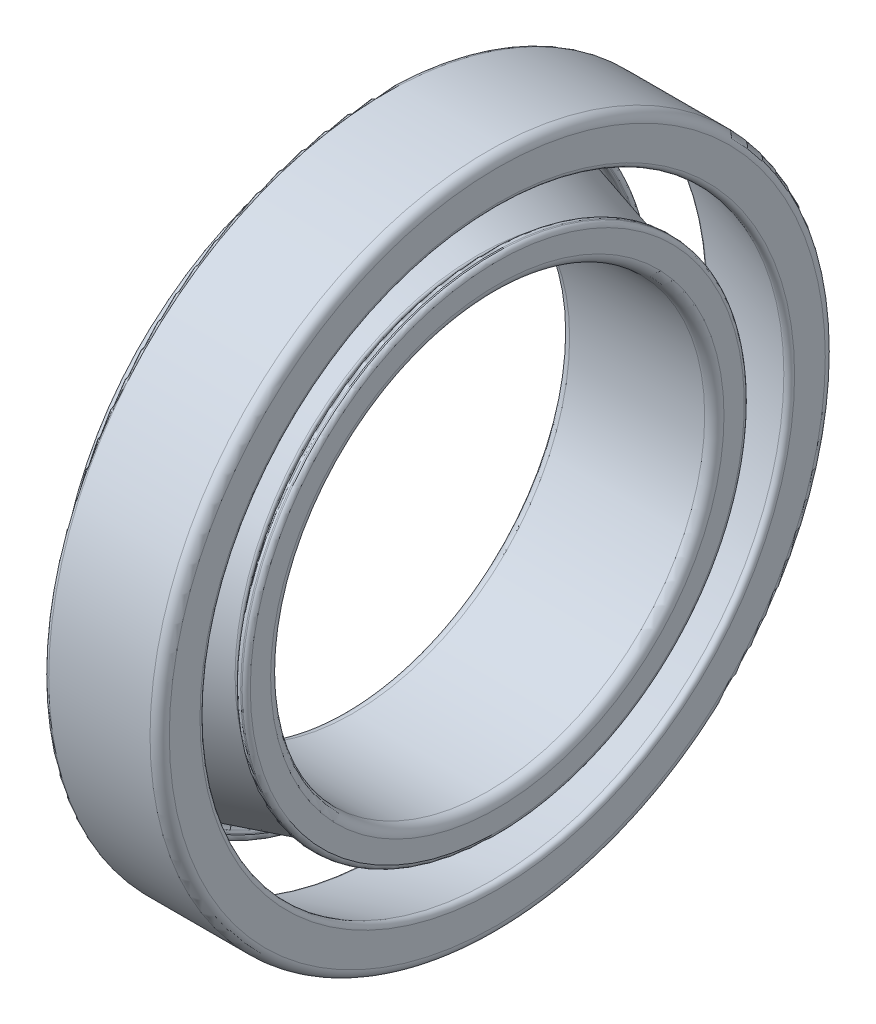
ISO-10303-21;
HEADER;
FILE_DESCRIPTION(('STEP AP214'),'2;1');
FILE_NAME('part.step','',(''),(''),'','','');
FILE_SCHEMA(('AUTOMOTIVE_DESIGN { 1 0 10303 214 1 1 1 1 }'));
ENDSEC;
DATA;
#1=APPLICATION_CONTEXT('core data for automotive mechanical design processes');
#2=APPLICATION_PROTOCOL_DEFINITION('international standard','automotive_design',2000,#1);
#3=PRODUCT_CONTEXT('',#1,'mechanical');
#4=PRODUCT('Part','Part','',(#3));
#5=PRODUCT_RELATED_PRODUCT_CATEGORY('part','',(#4));
#6=PRODUCT_DEFINITION_FORMATION('','',#4);
#7=PRODUCT_DEFINITION_CONTEXT('part definition',#1,'design');
#8=PRODUCT_DEFINITION('design','',#6,#7);
#9=PRODUCT_DEFINITION_SHAPE('','',#8);
#10=(LENGTH_UNIT() NAMED_UNIT(*) SI_UNIT(.MILLI.,.METRE.));
#11=(NAMED_UNIT(*) PLANE_ANGLE_UNIT() SI_UNIT($,.RADIAN.));
#12=(NAMED_UNIT(*) SI_UNIT($,.STERADIAN.) SOLID_ANGLE_UNIT());
#13=UNCERTAINTY_MEASURE_WITH_UNIT(LENGTH_MEASURE(1.E-05),#10,'distance_accuracy_value','');
#14=(GEOMETRIC_REPRESENTATION_CONTEXT(3) GLOBAL_UNCERTAINTY_ASSIGNED_CONTEXT((#13)) GLOBAL_UNIT_ASSIGNED_CONTEXT((#10,
#11,#12)) REPRESENTATION_CONTEXT('',''));
#15=CARTESIAN_POINT('',(0.,0.,0.));
#16=DIRECTION('',(0.,0.,1.));
#17=DIRECTION('',(1.,0.,0.));
#18=AXIS2_PLACEMENT_3D('',#15,#16,#17);
#19=CARTESIAN_POINT('',(-1.99999999999999,0.,0.));
#20=DIRECTION('',(-1.,0.,0.));
#21=DIRECTION('',(0.,0.,1.));
#22=AXIS2_PLACEMENT_3D('',#19,#20,#21);
#23=TOROIDAL_SURFACE('',#22,47.,2.);
#24=CARTESIAN_POINT('',(0.,0.,0.));
#25=DIRECTION('',(-1.,0.,0.));
#26=DIRECTION('',(0.,0.,1.));
#27=AXIS2_PLACEMENT_3D('',#24,#25,#26);
#28=CIRCLE('',#27,47.);
#29=CARTESIAN_POINT('',(0.,0.,47.));
#30=VERTEX_POINT('',#29);
#31=EDGE_CURVE('E103',#30,#30,#28,.T.);
#32=ORIENTED_EDGE('',*,*,#31,.F.);
#33=EDGE_LOOP('',(#32));
#34=FACE_BOUND('',#33,.T.);
#35=CARTESIAN_POINT('',(-1.99999999999999,0.,0.));
#36=DIRECTION('',(-1.,0.,0.));
#37=DIRECTION('',(0.,0.,1.));
#38=AXIS2_PLACEMENT_3D('',#35,#36,#37);
#39=CIRCLE('',#38,45.);
#40=CARTESIAN_POINT('',(-1.99999999999999,0.,45.));
#41=VERTEX_POINT('',#40);
#42=EDGE_CURVE('E11',#41,#41,#39,.T.);
#43=ORIENTED_EDGE('',*,*,#42,.T.);
#44=EDGE_LOOP('',(#43));
#45=FACE_BOUND('',#44,.T.);
#46=ADVANCED_FACE('F39',(#34,#45),#23,.T.);
#47=CARTESIAN_POINT('',(0.,0.,0.));
#48=DIRECTION('',(-1.,0.,0.));
#49=DIRECTION('',(0.,0.,1.));
#50=AXIS2_PLACEMENT_3D('',#47,#48,#49);
#51=CYLINDRICAL_SURFACE('',#50,45.);
#52=ORIENTED_EDGE('',*,*,#42,.F.);
#53=EDGE_LOOP('',(#52));
#54=FACE_BOUND('',#53,.T.);
#55=CARTESIAN_POINT('',(-30.,0.,0.));
#56=DIRECTION('',(-1.,0.,0.));
#57=DIRECTION('',(0.,0.,1.));
#58=AXIS2_PLACEMENT_3D('',#55,#56,#57);
#59=CIRCLE('',#58,45.);
#60=CARTESIAN_POINT('',(-30.,0.,45.));
#61=VERTEX_POINT('',#60);
#62=EDGE_CURVE('E45',#61,#61,#59,.T.);
#63=ORIENTED_EDGE('',*,*,#62,.T.);
#64=EDGE_LOOP('',(#63));
#65=FACE_BOUND('',#64,.T.);
#66=ADVANCED_FACE('F110',(#54,#65),#51,.F.);
#67=CARTESIAN_POINT('',(-30.,0.,0.));
#68=DIRECTION('',(-1.,0.,0.));
#69=DIRECTION('',(0.,0.,1.));
#70=AXIS2_PLACEMENT_3D('',#67,#68,#69);
#71=TOROIDAL_SURFACE('',#70,47.,2.);
#72=ORIENTED_EDGE('',*,*,#62,.F.);
#73=EDGE_LOOP('',(#72));
#74=FACE_BOUND('',#73,.T.);
#75=CARTESIAN_POINT('',(-32.,0.,0.));
#76=DIRECTION('',(-1.,0.,0.));
#77=DIRECTION('',(0.,0.,1.));
#78=AXIS2_PLACEMENT_3D('',#75,#76,#77);
#79=CIRCLE('',#78,47.);
#80=CARTESIAN_POINT('',(-32.,0.,47.));
#81=VERTEX_POINT('',#80);
#82=EDGE_CURVE('E49',#81,#81,#79,.T.);
#83=ORIENTED_EDGE('',*,*,#82,.T.);
#84=EDGE_LOOP('',(#83));
#85=FACE_BOUND('',#84,.T.);
#86=ADVANCED_FACE('F114',(#74,#85),#71,.T.);
#87=CARTESIAN_POINT('',(-32.,47.,0.));
#88=DIRECTION('',(1.,0.,0.));
#89=DIRECTION('',(0.,0.,-1.));
#90=AXIS2_PLACEMENT_3D('',#87,#88,#89);
#91=PLANE('',#90);
#92=ORIENTED_EDGE('',*,*,#82,.F.);
#93=EDGE_LOOP('',(#92));
#94=FACE_BOUND('',#93,.T.);
#95=CARTESIAN_POINT('',(-32.,0.,0.));
#96=DIRECTION('',(-1.,0.,0.));
#97=DIRECTION('',(0.,0.,1.));
#98=AXIS2_PLACEMENT_3D('',#95,#96,#97);
#99=CIRCLE('',#98,58.2391318637629);
#100=CARTESIAN_POINT('',(-32.,0.,58.2391318637629));
#101=VERTEX_POINT('',#100);
#102=EDGE_CURVE('E53',#101,#101,#99,.T.);
#103=ORIENTED_EDGE('',*,*,#102,.T.);
#104=EDGE_LOOP('',(#103));
#105=FACE_BOUND('',#104,.T.);
#106=ADVANCED_FACE('F119',(#94,#105),#91,.F.);
#107=CARTESIAN_POINT('',(-30.,0.,0.));
#108=DIRECTION('',(-1.,0.,0.));
#109=DIRECTION('',(0.,0.,1.));
#110=AXIS2_PLACEMENT_3D('',#107,#108,#109);
#111=TOROIDAL_SURFACE('',#110,58.2391318637629,2.);
#112=ORIENTED_EDGE('',*,*,#102,.F.);
#113=EDGE_LOOP('',(#112));
#114=FACE_BOUND('',#113,.T.);
#115=CARTESIAN_POINT('',(-29.4639402216647,0.,0.));
#116=DIRECTION('',(-1.,0.,0.));
#117=DIRECTION('',(0.,0.,1.));
#118=AXIS2_PLACEMENT_3D('',#115,#116,#117);
#119=CIRCLE('',#118,60.1659530578676);
#120=CARTESIAN_POINT('',(-29.4639402216647,0.,60.1659530578676));
#121=VERTEX_POINT('',#120);
#122=EDGE_CURVE('E58',#121,#121,#119,.T.);
#123=ORIENTED_EDGE('',*,*,#122,.T.);
#124=EDGE_LOOP('',(#123));
#125=FACE_BOUND('',#124,.T.);
#126=ADVANCED_FACE('F125',(#114,#125),#111,.T.);
#127=CARTESIAN_POINT('',(-27.887122306512,0.,0.));
#128=DIRECTION('',(-1.,0.,0.));
#129=DIRECTION('',(0.,0.,1.));
#130=AXIS2_PLACEMENT_3D('',#127,#128,#129);
#131=CONICAL_SURFACE('',#130,59.727267483587,0.27134751427073);
#132=ORIENTED_EDGE('',*,*,#122,.F.);
#133=EDGE_LOOP('',(#132));
#134=FACE_BOUND('',#133,.T.);
#135=CARTESIAN_POINT('',(-27.887122306512,0.,0.));
#136=DIRECTION('',(-1.,0.,0.));
#137=DIRECTION('',(0.,0.,1.));
#138=AXIS2_PLACEMENT_3D('',#135,#136,#137);
#139=CIRCLE('',#138,59.727267483587);
#140=CARTESIAN_POINT('',(-27.887122306512,0.,59.727267483587));
#141=VERTEX_POINT('',#140);
#142=EDGE_CURVE('E61',#141,#141,#139,.T.);
#143=ORIENTED_EDGE('',*,*,#142,.T.);
#144=EDGE_LOOP('',(#143));
#145=FACE_BOUND('',#144,.T.);
#146=ADVANCED_FACE('F129',(#134,#145),#131,.T.);
#147=CARTESIAN_POINT('',(-28.1551521956797,0.,0.));
#148=DIRECTION('',(-1.,0.,0.));
#149=DIRECTION('',(0.,0.,1.));
#150=AXIS2_PLACEMENT_3D('',#147,#148,#149);
#151=TOROIDAL_SURFACE('',#150,58.7638568865347,1.00000000000001);
#152=ORIENTED_EDGE('',*,*,#142,.F.);
#153=EDGE_LOOP('',(#152));
#154=FACE_BOUND('',#153,.T.);
#155=CARTESIAN_POINT('',(-27.1917415986273,0.,0.));
#156=DIRECTION('',(-1.,0.,0.));
#157=DIRECTION('',(0.,0.,1.));
#158=AXIS2_PLACEMENT_3D('',#155,#156,#157);
#159=CIRCLE('',#158,58.495826997367);
#160=CARTESIAN_POINT('',(-27.1917415986273,0.,58.495826997367));
#161=VERTEX_POINT('',#160);
#162=EDGE_CURVE('E64',#161,#161,#159,.T.);
#163=ORIENTED_EDGE('',*,*,#162,.T.);
#164=EDGE_LOOP('',(#163));
#165=FACE_BOUND('',#164,.T.);
#166=ADVANCED_FACE('F133',(#154,#165),#151,.T.);
#167=CARTESIAN_POINT('',(-27.2415379169133,0.,0.));
#168=DIRECTION('',(1.,0.,0.));
#169=DIRECTION('',(0.,0.,-1.));
#170=AXIS2_PLACEMENT_3D('',#167,#168,#169);
#171=CONICAL_SURFACE('',#170,58.3168383745686,1.29944881252416);
#172=ORIENTED_EDGE('',*,*,#162,.F.);
#173=EDGE_LOOP('',(#172));
#174=FACE_BOUND('',#173,.T.);
#175=CARTESIAN_POINT('',(-27.2415379169133,0.,0.));
#176=DIRECTION('',(-1.,0.,0.));
#177=DIRECTION('',(0.,0.,1.));
#178=AXIS2_PLACEMENT_3D('',#175,#176,#177);
#179=CIRCLE('',#178,58.3168383745686);
#180=CARTESIAN_POINT('',(-27.2415379169133,0.,58.3168383745686));
#181=VERTEX_POINT('',#180);
#182=EDGE_CURVE('E67',#181,#181,#179,.T.);
#183=ORIENTED_EDGE('',*,*,#182,.T.);
#184=EDGE_LOOP('',(#183));
#185=FACE_BOUND('',#184,.T.);
#186=ADVANCED_FACE('F137',(#174,#185),#171,.F.);
#187=CARTESIAN_POINT('',(-27.7232432154395,0.,0.));
#188=DIRECTION('',(-1.,0.,0.));
#189=DIRECTION('',(0.,0.,1.));
#190=AXIS2_PLACEMENT_3D('',#187,#188,#189);
#191=TOROIDAL_SURFACE('',#190,58.4508533191525,0.49999999999999);
#192=ORIENTED_EDGE('',*,*,#182,.F.);
#193=EDGE_LOOP('',(#192));
#194=FACE_BOUND('',#193,.T.);
#195=CARTESIAN_POINT('',(-27.6890252840582,0.,0.));
#196=DIRECTION('',(-1.,0.,0.));
#197=DIRECTION('',(0.,0.,1.));
#198=AXIS2_PLACEMENT_3D('',#195,#196,#197);
#199=CIRCLE('',#198,57.9520255601294);
#200=CARTESIAN_POINT('',(-27.6890252840582,0.,57.9520255601294));
#201=VERTEX_POINT('',#200);
#202=EDGE_CURVE('E70',#201,#201,#199,.T.);
#203=ORIENTED_EDGE('',*,*,#202,.T.);
#204=EDGE_LOOP('',(#203));
#205=FACE_BOUND('',#204,.T.);
#206=ADVANCED_FACE('F141',(#194,#205),#191,.T.);
#207=CARTESIAN_POINT('',(-27.6205894212956,0.,0.));
#208=DIRECTION('',(-1.,0.,0.));
#209=DIRECTION('',(0.,0.,1.));
#210=AXIS2_PLACEMENT_3D('',#207,#208,#209);
#211=TOROIDAL_SURFACE('',#210,56.9543700420832,1.);
#212=ORIENTED_EDGE('',*,*,#202,.F.);
#213=EDGE_LOOP('',(#212));
#214=FACE_BOUND('',#213,.T.);
#215=CARTESIAN_POINT('',(-26.8016204960278,0.,0.));
#216=DIRECTION('',(-1.,0.,0.));
#217=DIRECTION('',(0.,0.,1.));
#218=AXIS2_PLACEMENT_3D('',#215,#216,#217);
#219=CIRCLE('',#218,56.3805321734776);
#220=CARTESIAN_POINT('',(-26.8016204960278,0.,56.3805321734776));
#221=VERTEX_POINT('',#220);
#222=EDGE_CURVE('E73',#221,#221,#219,.T.);
#223=ORIENTED_EDGE('',*,*,#222,.T.);
#224=EDGE_LOOP('',(#223));
#225=FACE_BOUND('',#224,.T.);
#226=ADVANCED_FACE('F145',(#214,#225),#211,.F.);
#227=CARTESIAN_POINT('',(-26.392136033394,0.,0.));
#228=DIRECTION('',(-1.,0.,0.));
#229=DIRECTION('',(0.,0.,1.));
#230=AXIS2_PLACEMENT_3D('',#227,#228,#229);
#231=TOROIDAL_SURFACE('',#230,56.0936132391748,0.5);
#232=ORIENTED_EDGE('',*,*,#222,.F.);
#233=EDGE_LOOP('',(#232));
#234=FACE_BOUND('',#233,.T.);
#235=CARTESIAN_POINT('',(-26.2581210888102,0.,0.));
#236=DIRECTION('',(-1.,0.,0.));
#237=DIRECTION('',(0.,0.,1.));
#238=AXIS2_PLACEMENT_3D('',#235,#236,#237);
#239=CIRCLE('',#238,56.575318537701);
#240=CARTESIAN_POINT('',(-26.2581210888102,0.,56.575318537701));
#241=VERTEX_POINT('',#240);
#242=EDGE_CURVE('E76',#241,#241,#239,.T.);
#243=ORIENTED_EDGE('',*,*,#242,.T.);
#244=EDGE_LOOP('',(#243));
#245=FACE_BOUND('',#244,.T.);
#246=ADVANCED_FACE('F149',(#234,#245),#231,.T.);
#247=CARTESIAN_POINT('',(-3.98616723842599,0.,0.));
#248=DIRECTION('',(-1.,0.,0.));
#249=DIRECTION('',(0.,0.,1.));
#250=AXIS2_PLACEMENT_3D('',#247,#248,#249);
#251=CONICAL_SURFACE('',#250,50.3790515043822,0.271347514270736);
#252=ORIENTED_EDGE('',*,*,#242,.F.);
#253=EDGE_LOOP('',(#252));
#254=FACE_BOUND('',#253,.T.);
#255=CARTESIAN_POINT('',(-3.98616723842599,0.,0.));
#256=DIRECTION('',(-1.,0.,0.));
#257=DIRECTION('',(0.,0.,1.));
#258=AXIS2_PLACEMENT_3D('',#255,#256,#257);
#259=CIRCLE('',#258,50.3790515043822);
#260=CARTESIAN_POINT('',(-3.98616723842599,0.,50.3790515043822));
#261=VERTEX_POINT('',#260);
#262=EDGE_CURVE('E79',#261,#261,#259,.T.);
#263=ORIENTED_EDGE('',*,*,#262,.T.);
#264=EDGE_LOOP('',(#263));
#265=FACE_BOUND('',#264,.T.);
#266=ADVANCED_FACE('F153',(#254,#265),#251,.T.);
#267=CARTESIAN_POINT('',(-4.12018218300982,0.,0.));
#268=DIRECTION('',(-1.,0.,0.));
#269=DIRECTION('',(0.,0.,1.));
#270=AXIS2_PLACEMENT_3D('',#267,#268,#269);
#271=TOROIDAL_SURFACE('',#270,49.8973462058561,0.500000000000001);
#272=ORIENTED_EDGE('',*,*,#262,.F.);
#273=EDGE_LOOP('',(#272));
#274=FACE_BOUND('',#273,.T.);
#275=CARTESIAN_POINT('',(-3.62135442398673,0.,0.));
#276=DIRECTION('',(-1.,0.,0.));
#277=DIRECTION('',(0.,0.,1.));
#278=AXIS2_PLACEMENT_3D('',#275,#276,#277);
#279=CIRCLE('',#278,49.9315641372374);
#280=CARTESIAN_POINT('',(-3.62135442398673,0.,49.9315641372374));
#281=VERTEX_POINT('',#280);
#282=EDGE_CURVE('E82',#281,#281,#279,.T.);
#283=ORIENTED_EDGE('',*,*,#282,.T.);
#284=EDGE_LOOP('',(#283));
#285=FACE_BOUND('',#284,.T.);
#286=ADVANCED_FACE('F157',(#274,#285),#271,.T.);
#287=CARTESIAN_POINT('',(-2.62369890594058,0.,0.));
#288=DIRECTION('',(-1.,0.,0.));
#289=DIRECTION('',(0.,0.,1.));
#290=AXIS2_PLACEMENT_3D('',#287,#288,#289);
#291=TOROIDAL_SURFACE('',#290,50.,1.);
#292=ORIENTED_EDGE('',*,*,#282,.F.);
#293=EDGE_LOOP('',(#292));
#294=FACE_BOUND('',#293,.T.);
#295=CARTESIAN_POINT('',(-2.04986103733497,0.,0.));
#296=DIRECTION('',(-1.,0.,0.));
#297=DIRECTION('',(0.,0.,1.));
#298=AXIS2_PLACEMENT_3D('',#295,#296,#297);
#299=CIRCLE('',#298,50.8189689252677);
#300=CARTESIAN_POINT('',(-2.04986103733497,0.,50.8189689252677));
#301=VERTEX_POINT('',#300);
#302=EDGE_CURVE('E85',#301,#301,#299,.T.);
#303=ORIENTED_EDGE('',*,*,#302,.T.);
#304=EDGE_LOOP('',(#303));
#305=FACE_BOUND('',#304,.T.);
#306=ADVANCED_FACE('F161',(#294,#305),#291,.F.);
#307=CARTESIAN_POINT('',(-1.76294210303216,0.,0.));
#308=DIRECTION('',(-1.,0.,0.));
#309=DIRECTION('',(0.,0.,1.));
#310=AXIS2_PLACEMENT_3D('',#307,#308,#309);
#311=TOROIDAL_SURFACE('',#310,51.2284533879016,0.499999999999997);
#312=ORIENTED_EDGE('',*,*,#302,.F.);
#313=EDGE_LOOP('',(#312));
#314=FACE_BOUND('',#313,.T.);
#315=CARTESIAN_POINT('',(-2.24464740155833,0.,0.));
#316=DIRECTION('',(-1.,0.,0.));
#317=DIRECTION('',(0.,0.,1.));
#318=AXIS2_PLACEMENT_3D('',#315,#316,#317);
#319=CIRCLE('',#318,51.3624683324854);
#320=CARTESIAN_POINT('',(-2.24464740155833,0.,51.3624683324854));
#321=VERTEX_POINT('',#320);
#322=EDGE_CURVE('E88',#321,#321,#319,.T.);
#323=ORIENTED_EDGE('',*,*,#322,.T.);
#324=EDGE_LOOP('',(#323));
#325=FACE_BOUND('',#324,.T.);
#326=ADVANCED_FACE('F165',(#314,#325),#311,.T.);
#327=CARTESIAN_POINT('',(-2.19485108327235,0.,0.));
#328=DIRECTION('',(1.,0.,0.));
#329=DIRECTION('',(0.,0.,-1.));
#330=AXIS2_PLACEMENT_3D('',#327,#328,#329);
#331=CONICAL_SURFACE('',#330,51.5414569552838,1.29944881252424);
#332=ORIENTED_EDGE('',*,*,#322,.F.);
#333=EDGE_LOOP('',(#332));
#334=FACE_BOUND('',#333,.T.);
#335=CARTESIAN_POINT('',(-2.19485108327235,0.,0.));
#336=DIRECTION('',(-1.,0.,0.));
#337=DIRECTION('',(0.,0.,1.));
#338=AXIS2_PLACEMENT_3D('',#335,#336,#337);
#339=CIRCLE('',#338,51.5414569552838);
#340=CARTESIAN_POINT('',(-2.19485108327235,0.,51.5414569552838));
#341=VERTEX_POINT('',#340);
#342=EDGE_CURVE('E91',#341,#341,#339,.T.);
#343=ORIENTED_EDGE('',*,*,#342,.T.);
#344=EDGE_LOOP('',(#343));
#345=FACE_BOUND('',#344,.T.);
#346=ADVANCED_FACE('F169',(#334,#345),#331,.T.);
#347=CARTESIAN_POINT('',(-1.23144048621999,0.,0.));
#348=DIRECTION('',(-1.,0.,0.));
#349=DIRECTION('',(0.,0.,1.));
#350=AXIS2_PLACEMENT_3D('',#347,#348,#349);
#351=TOROIDAL_SURFACE('',#350,51.2734270661161,1.00000000000001);
#352=ORIENTED_EDGE('',*,*,#342,.F.);
#353=EDGE_LOOP('',(#352));
#354=FACE_BOUND('',#353,.T.);
#355=CARTESIAN_POINT('',(-0.963410597052338,0.,0.));
#356=DIRECTION('',(-1.,0.,0.));
#357=DIRECTION('',(0.,0.,1.));
#358=AXIS2_PLACEMENT_3D('',#355,#356,#357);
#359=CIRCLE('',#358,52.2368376631685);
#360=CARTESIAN_POINT('',(-0.963410597052338,0.,52.2368376631685));
#361=VERTEX_POINT('',#360);
#362=EDGE_CURVE('E94',#361,#361,#359,.T.);
#363=ORIENTED_EDGE('',*,*,#362,.T.);
#364=EDGE_LOOP('',(#363));
#365=FACE_BOUND('',#364,.T.);
#366=ADVANCED_FACE('F173',(#354,#365),#351,.T.);
#367=CARTESIAN_POINT('',(-0.731970110832333,0.,0.));
#368=DIRECTION('',(-1.,0.,0.));
#369=DIRECTION('',(0.,0.,1.));
#370=AXIS2_PLACEMENT_3D('',#367,#368,#369);
#371=CONICAL_SURFACE('',#370,52.1724487431584,0.271347514270737);
#372=ORIENTED_EDGE('',*,*,#362,.F.);
#373=EDGE_LOOP('',(#372));
#374=FACE_BOUND('',#373,.T.);
#375=CARTESIAN_POINT('',(-0.731970110832333,0.,0.));
#376=DIRECTION('',(-1.,0.,0.));
#377=DIRECTION('',(0.,0.,1.));
#378=AXIS2_PLACEMENT_3D('',#375,#376,#377);
#379=CIRCLE('',#378,52.1724487431584);
#380=CARTESIAN_POINT('',(-0.731970110832333,0.,52.1724487431584));
#381=VERTEX_POINT('',#380);
#382=EDGE_CURVE('E97',#381,#381,#379,.T.);
#383=ORIENTED_EDGE('',*,*,#382,.T.);
#384=EDGE_LOOP('',(#383));
#385=FACE_BOUND('',#384,.T.);
#386=ADVANCED_FACE('F177',(#374,#385),#371,.T.);
#387=CARTESIAN_POINT('',(-0.999999999999985,0.,0.));
#388=DIRECTION('',(-1.,0.,0.));
#389=DIRECTION('',(0.,0.,1.));
#390=AXIS2_PLACEMENT_3D('',#387,#388,#389);
#391=TOROIDAL_SURFACE('',#390,51.2090381461061,1.00000000000001);
#392=ORIENTED_EDGE('',*,*,#382,.F.);
#393=EDGE_LOOP('',(#392));
#394=FACE_BOUND('',#393,.T.);
#395=CARTESIAN_POINT('',(0.,0.,0.));
#396=DIRECTION('',(-1.,0.,0.));
#397=DIRECTION('',(0.,0.,1.));
#398=AXIS2_PLACEMENT_3D('',#395,#396,#397);
#399=CIRCLE('',#398,51.2090381461061);
#400=CARTESIAN_POINT('',(0.,0.,51.2090381461061));
#401=VERTEX_POINT('',#400);
#402=EDGE_CURVE('E100',#401,#401,#399,.T.);
#403=ORIENTED_EDGE('',*,*,#402,.T.);
#404=EDGE_LOOP('',(#403));
#405=FACE_BOUND('',#404,.T.);
#406=ADVANCED_FACE('F181',(#394,#405),#391,.T.);
#407=CARTESIAN_POINT('',(0.,51.2090381461061,0.));
#408=DIRECTION('',(-1.,0.,0.));
#409=DIRECTION('',(0.,0.,1.));
#410=AXIS2_PLACEMENT_3D('',#407,#408,#409);
#411=PLANE('',#410);
#412=ORIENTED_EDGE('',*,*,#402,.F.);
#413=EDGE_LOOP('',(#412));
#414=FACE_BOUND('',#413,.T.);
#415=ORIENTED_EDGE('',*,*,#31,.T.);
#416=EDGE_LOOP('',(#415));
#417=FACE_BOUND('',#416,.T.);
#418=ADVANCED_FACE('F107',(#414,#417),#411,.F.);
#419=CLOSED_SHELL('',(#46,#66,#86,#106,#126,#146,#166,#186,#206,#226,#246,#266,#286,#306,#326,
#346,#366,#386,#406,#418));
#420=MANIFOLD_SOLID_BREP('B2',#419);
#421=CARTESIAN_POINT('',(-23.,0.,0.));
#422=DIRECTION('',(-1.,0.,0.));
#423=DIRECTION('',(0.,0.,1.));
#424=AXIS2_PLACEMENT_3D('',#421,#422,#423);
#425=TOROIDAL_SURFACE('',#424,67.7597696278948,0.999999999999999);
#426=CARTESIAN_POINT('',(-23.2680298891677,0.,0.));
#427=DIRECTION('',(-1.,0.,0.));
#428=DIRECTION('',(0.,0.,1.));
#429=AXIS2_PLACEMENT_3D('',#426,#427,#428);
#430=CIRCLE('',#429,66.7963590308424);
#431=CARTESIAN_POINT('',(-23.2680298891677,0.,66.7963590308424));
#432=VERTEX_POINT('',#431);
#433=EDGE_CURVE('E38',#432,#432,#430,.T.);
#434=ORIENTED_EDGE('',*,*,#433,.F.);
#435=EDGE_LOOP('',(#434));
#436=FACE_BOUND('',#435,.T.);
#437=CARTESIAN_POINT('',(-24.,0.,0.));
#438=DIRECTION('',(-1.,0.,0.));
#439=DIRECTION('',(0.,0.,1.));
#440=AXIS2_PLACEMENT_3D('',#437,#438,#439);
#441=CIRCLE('',#440,67.7597696278948);
#442=CARTESIAN_POINT('',(-24.,0.,67.7597696278948));
#443=VERTEX_POINT('',#442);
#444=EDGE_CURVE('E369',#443,#443,#441,.T.);
#445=ORIENTED_EDGE('',*,*,#444,.T.);
#446=EDGE_LOOP('',(#445));
#447=FACE_BOUND('',#446,.T.);
#448=ADVANCED_FACE('F341',(#436,#447),#425,.T.);
#449=CARTESIAN_POINT('',(-23.2680298891677,0.,0.));
#450=DIRECTION('',(-1.,0.,0.));
#451=DIRECTION('',(0.,0.,1.));
#452=AXIS2_PLACEMENT_3D('',#449,#450,#451);
#453=CONICAL_SURFACE('',#452,66.7963590308424,0.271347514270737);
#454=CARTESIAN_POINT('',(-1.26802988916765,0.,0.));
#455=DIRECTION('',(-1.,0.,0.));
#456=DIRECTION('',(0.,0.,1.));
#457=AXIS2_PLACEMENT_3D('',#454,#455,#456);
#458=CIRCLE('',#457,60.6757521164804);
#459=CARTESIAN_POINT('',(-1.26802988916765,0.,60.6757521164804));
#460=VERTEX_POINT('',#459);
#461=EDGE_CURVE('E347',#460,#460,#458,.T.);
#462=ORIENTED_EDGE('',*,*,#461,.F.);
#463=EDGE_LOOP('',(#462));
#464=FACE_BOUND('',#463,.T.);
#465=ORIENTED_EDGE('',*,*,#433,.T.);
#466=EDGE_LOOP('',(#465));
#467=FACE_BOUND('',#466,.T.);
#468=ADVANCED_FACE('F406',(#464,#467),#453,.F.);
#469=CARTESIAN_POINT('',(-1.,0.,0.));
#470=DIRECTION('',(-1.,0.,0.));
#471=DIRECTION('',(0.,0.,1.));
#472=AXIS2_PLACEMENT_3D('',#469,#470,#471);
#473=TOROIDAL_SURFACE('',#472,61.6391627135328,1.);
#474=CARTESIAN_POINT('',(0.,0.,0.));
#475=DIRECTION('',(-1.,0.,0.));
#476=DIRECTION('',(0.,0.,1.));
#477=AXIS2_PLACEMENT_3D('',#474,#475,#476);
#478=CIRCLE('',#477,61.6391627135328);
#479=CARTESIAN_POINT('',(0.,0.,61.6391627135328));
#480=VERTEX_POINT('',#479);
#481=EDGE_CURVE('E351',#480,#480,#478,.T.);
#482=ORIENTED_EDGE('',*,*,#481,.F.);
#483=EDGE_LOOP('',(#482));
#484=FACE_BOUND('',#483,.T.);
#485=ORIENTED_EDGE('',*,*,#461,.T.);
#486=EDGE_LOOP('',(#485));
#487=FACE_BOUND('',#486,.T.);
#488=ADVANCED_FACE('F401',(#484,#487),#473,.T.);
#489=CARTESIAN_POINT('',(0.,68.,0.));
#490=DIRECTION('',(-1.,0.,0.));
#491=DIRECTION('',(0.,0.,1.));
#492=AXIS2_PLACEMENT_3D('',#489,#490,#491);
#493=PLANE('',#492);
#494=CARTESIAN_POINT('',(0.,0.,0.));
#495=DIRECTION('',(-1.,0.,0.));
#496=DIRECTION('',(0.,0.,1.));
#497=AXIS2_PLACEMENT_3D('',#494,#495,#496);
#498=CIRCLE('',#497,68.);
#499=CARTESIAN_POINT('',(0.,0.,68.));
#500=VERTEX_POINT('',#499);
#501=EDGE_CURVE('E355',#500,#500,#498,.T.);
#502=ORIENTED_EDGE('',*,*,#501,.F.);
#503=EDGE_LOOP('',(#502));
#504=FACE_BOUND('',#503,.T.);
#505=ORIENTED_EDGE('',*,*,#481,.T.);
#506=EDGE_LOOP('',(#505));
#507=FACE_BOUND('',#506,.T.);
#508=ADVANCED_FACE('F395',(#504,#507),#493,.F.);
#509=CARTESIAN_POINT('',(-2.,0.,0.));
#510=DIRECTION('',(-1.,0.,0.));
#511=DIRECTION('',(0.,0.,1.));
#512=AXIS2_PLACEMENT_3D('',#509,#510,#511);
#513=TOROIDAL_SURFACE('',#512,68.,2.);
#514=CARTESIAN_POINT('',(-2.,0.,0.));
#515=DIRECTION('',(-1.,0.,0.));
#516=DIRECTION('',(0.,0.,1.));
#517=AXIS2_PLACEMENT_3D('',#514,#515,#516);
#518=CIRCLE('',#517,70.);
#519=CARTESIAN_POINT('',(-2.,0.,70.));
#520=VERTEX_POINT('',#519);
#521=EDGE_CURVE('E360',#520,#520,#518,.T.);
#522=ORIENTED_EDGE('',*,*,#521,.F.);
#523=EDGE_LOOP('',(#522));
#524=FACE_BOUND('',#523,.T.);
#525=ORIENTED_EDGE('',*,*,#501,.T.);
#526=EDGE_LOOP('',(#525));
#527=FACE_BOUND('',#526,.T.);
#528=ADVANCED_FACE('F389',(#524,#527),#513,.T.);
#529=CARTESIAN_POINT('',(0.,0.,0.));
#530=DIRECTION('',(-1.,0.,0.));
#531=DIRECTION('',(0.,0.,1.));
#532=AXIS2_PLACEMENT_3D('',#529,#530,#531);
#533=CYLINDRICAL_SURFACE('',#532,70.);
#534=CARTESIAN_POINT('',(-23.,0.,0.));
#535=DIRECTION('',(-1.,0.,0.));
#536=DIRECTION('',(0.,0.,1.));
#537=AXIS2_PLACEMENT_3D('',#534,#535,#536);
#538=CIRCLE('',#537,70.);
#539=CARTESIAN_POINT('',(-23.,0.,70.));
#540=VERTEX_POINT('',#539);
#541=EDGE_CURVE('E363',#540,#540,#538,.T.);
#542=ORIENTED_EDGE('',*,*,#541,.F.);
#543=EDGE_LOOP('',(#542));
#544=FACE_BOUND('',#543,.T.);
#545=ORIENTED_EDGE('',*,*,#521,.T.);
#546=EDGE_LOOP('',(#545));
#547=FACE_BOUND('',#546,.T.);
#548=ADVANCED_FACE('F383',(#544,#547),#533,.T.);
#549=CARTESIAN_POINT('',(-23.,0.,0.));
#550=DIRECTION('',(-1.,0.,0.));
#551=DIRECTION('',(0.,0.,1.));
#552=AXIS2_PLACEMENT_3D('',#549,#550,#551);
#553=TOROIDAL_SURFACE('',#552,69.,1.);
#554=CARTESIAN_POINT('',(-24.,0.,0.));
#555=DIRECTION('',(-1.,0.,0.));
#556=DIRECTION('',(0.,0.,1.));
#557=AXIS2_PLACEMENT_3D('',#554,#555,#556);
#558=CIRCLE('',#557,69.);
#559=CARTESIAN_POINT('',(-24.,0.,69.));
#560=VERTEX_POINT('',#559);
#561=EDGE_CURVE('E366',#560,#560,#558,.T.);
#562=ORIENTED_EDGE('',*,*,#561,.F.);
#563=EDGE_LOOP('',(#562));
#564=FACE_BOUND('',#563,.T.);
#565=ORIENTED_EDGE('',*,*,#541,.T.);
#566=EDGE_LOOP('',(#565));
#567=FACE_BOUND('',#566,.T.);
#568=ADVANCED_FACE('F377',(#564,#567),#553,.T.);
#569=CARTESIAN_POINT('',(-24.,69.,0.));
#570=DIRECTION('',(1.,0.,0.));
#571=DIRECTION('',(0.,0.,-1.));
#572=AXIS2_PLACEMENT_3D('',#569,#570,#571);
#573=PLANE('',#572);
#574=ORIENTED_EDGE('',*,*,#444,.F.);
#575=EDGE_LOOP('',(#574));
#576=FACE_BOUND('',#575,.T.);
#577=ORIENTED_EDGE('',*,*,#561,.T.);
#578=EDGE_LOOP('',(#577));
#579=FACE_BOUND('',#578,.T.);
#580=ADVANCED_FACE('F374',(#576,#579),#573,.F.);
#581=CLOSED_SHELL('',(#448,#468,#488,#508,#528,#548,#568,#580));
#582=MANIFOLD_SOLID_BREP('B6',#581);
#583=ADVANCED_BREP_SHAPE_REPRESENTATION('',(#18,#420,#582),#14);
#584=SHAPE_DEFINITION_REPRESENTATION(#9,#583);
ENDSEC;
END-ISO-10303-21;
